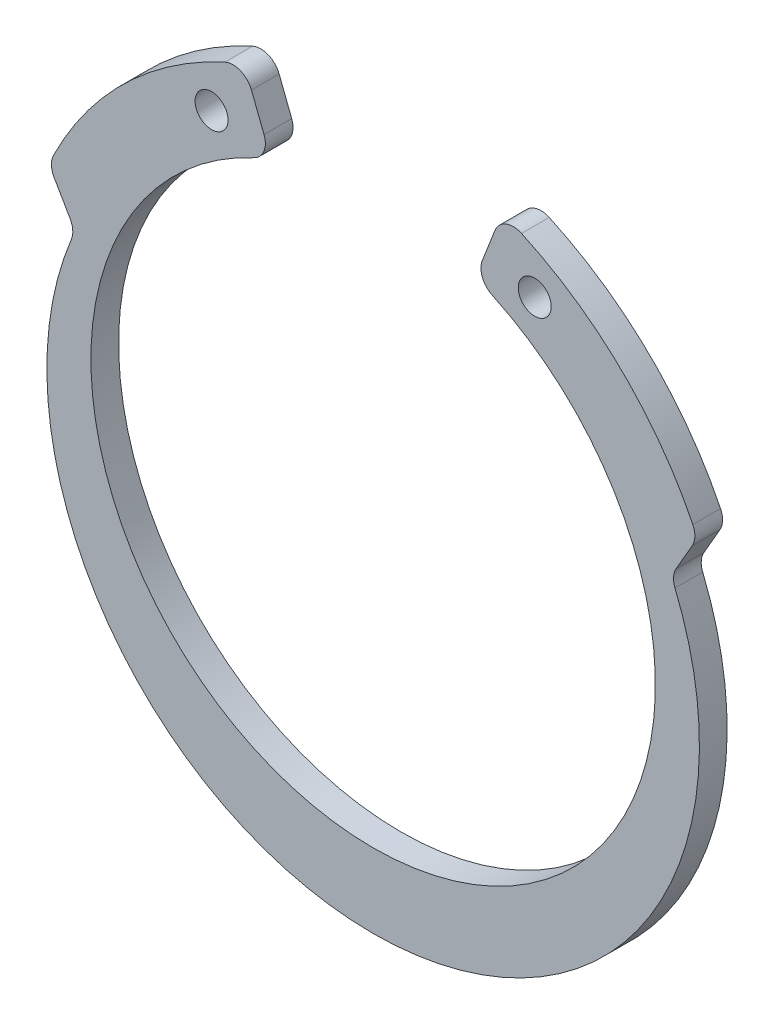
ISO-10303-21;
HEADER;
FILE_DESCRIPTION(('STEP AP214'),'2;1');
FILE_NAME('part.step','',(''),(''),'','','');
FILE_SCHEMA(('AUTOMOTIVE_DESIGN { 1 0 10303 214 1 1 1 1 }'));
ENDSEC;
DATA;
#1=APPLICATION_CONTEXT('core data for automotive mechanical design processes');
#2=APPLICATION_PROTOCOL_DEFINITION('international standard','automotive_design',2000,#1);
#3=PRODUCT_CONTEXT('',#1,'mechanical');
#4=PRODUCT('Part','Part','',(#3));
#5=PRODUCT_RELATED_PRODUCT_CATEGORY('part','',(#4));
#6=PRODUCT_DEFINITION_FORMATION('','',#4);
#7=PRODUCT_DEFINITION_CONTEXT('part definition',#1,'design');
#8=PRODUCT_DEFINITION('design','',#6,#7);
#9=PRODUCT_DEFINITION_SHAPE('','',#8);
#10=(LENGTH_UNIT() NAMED_UNIT(*) SI_UNIT(.MILLI.,.METRE.));
#11=(NAMED_UNIT(*) PLANE_ANGLE_UNIT() SI_UNIT($,.RADIAN.));
#12=(NAMED_UNIT(*) SI_UNIT($,.STERADIAN.) SOLID_ANGLE_UNIT());
#13=UNCERTAINTY_MEASURE_WITH_UNIT(LENGTH_MEASURE(1.E-05),#10,'distance_accuracy_value','');
#14=(GEOMETRIC_REPRESENTATION_CONTEXT(3) GLOBAL_UNCERTAINTY_ASSIGNED_CONTEXT((#13)) GLOBAL_UNIT_ASSIGNED_CONTEXT((#10,
#11,#12)) REPRESENTATION_CONTEXT('',''));
#15=CARTESIAN_POINT('',(0.,0.,0.));
#16=DIRECTION('',(0.,0.,1.));
#17=DIRECTION('',(1.,0.,0.));
#18=AXIS2_PLACEMENT_3D('',#15,#16,#17);
#19=CARTESIAN_POINT('',(0.,0.,0.5334));
#20=DIRECTION('',(0.,0.,1.));
#21=DIRECTION('',(1.,0.,0.));
#22=AXIS2_PLACEMENT_3D('',#19,#20,#21);
#23=PLANE('',#22);
#24=DIRECTION('',(-0.36214953271028,-0.932120011563814,0.));
#25=VECTOR('',#24,1.);
#26=CARTESIAN_POINT('',(4.97184228971963,12.7967960027561,0.5334));
#27=LINE('',#26,#25);
#28=CARTESIAN_POINT('',(4.68776887253002,12.0656325108856,0.5334));
#29=VERTEX_POINT('',#28);
#30=CARTESIAN_POINT('',(4.20391030476,10.820251216563,0.5334));
#31=VERTEX_POINT('',#30);
#32=EDGE_CURVE('E280',#29,#31,#27,.T.);
#33=ORIENTED_EDGE('',*,*,#32,.T.);
#34=CARTESIAN_POINT('',(4.91418575357163,10.5442932726377,0.5334));
#35=DIRECTION('',(0.,0.,1.));
#36=DIRECTION('',(1.,0.,0.));
#37=AXIS2_PLACEMENT_3D('',#34,#35,#36);
#38=CIRCLE('',#37,0.762);
#39=CARTESIAN_POINT('',(4.59229585704947,9.85361904080558,0.5334));
#40=VERTEX_POINT('',#39);
#41=EDGE_CURVE('E329',#31,#40,#38,.T.);
#42=ORIENTED_EDGE('',*,*,#41,.T.);
#43=CARTESIAN_POINT('',(0.,0.,0.5334));
#44=DIRECTION('',(0.,0.,-1.));
#45=DIRECTION('',(1.,0.,0.));
#46=AXIS2_PLACEMENT_3D('',#43,#44,#45);
#47=CIRCLE('',#46,10.8712);
#48=CARTESIAN_POINT('',(-4.59229585704947,9.85361904080558,0.5334));
#49=VERTEX_POINT('',#48);
#50=EDGE_CURVE('E285',#40,#49,#47,.T.);
#51=ORIENTED_EDGE('',*,*,#50,.T.);
#52=CARTESIAN_POINT('',(-4.91418575357163,10.5442932726377,0.5334));
#53=DIRECTION('',(0.,0.,-1.));
#54=DIRECTION('',(-1.,0.,0.));
#55=AXIS2_PLACEMENT_3D('',#52,#53,#54);
#56=CIRCLE('',#55,0.762);
#57=CARTESIAN_POINT('',(-4.20391030476,10.820251216563,0.5334));
#58=VERTEX_POINT('',#57);
#59=EDGE_CURVE('E208',#58,#49,#56,.T.);
#60=ORIENTED_EDGE('',*,*,#59,.F.);
#61=DIRECTION('',(0.36214953271028,-0.932120011563814,0.));
#62=VECTOR('',#61,1.);
#63=CARTESIAN_POINT('',(-4.97184228971963,12.7967960027561,0.5334));
#64=LINE('',#63,#62);
#65=CARTESIAN_POINT('',(-4.68776887253002,12.0656325108856,0.5334));
#66=VERTEX_POINT('',#65);
#67=EDGE_CURVE('E580',#66,#58,#64,.T.);
#68=ORIENTED_EDGE('',*,*,#67,.F.);
#69=CARTESIAN_POINT('',(-5.39804432134165,11.7896745669603,0.5334));
#70=DIRECTION('',(0.,0.,-1.));
#71=DIRECTION('',(-1.,0.,0.));
#72=AXIS2_PLACEMENT_3D('',#69,#70,#71);
#73=CIRCLE('',#72,0.762);
#74=CARTESIAN_POINT('',(-5.71526533924615,12.4825055895045,0.5334));
#75=VERTEX_POINT('',#74);
#76=EDGE_CURVE('E237',#75,#66,#73,.T.);
#77=ORIENTED_EDGE('',*,*,#76,.F.);
#78=CARTESIAN_POINT('',(0.,0.,0.5334));
#79=DIRECTION('',(0.,0.,-1.));
#80=DIRECTION('',(-1.,0.,0.));
#81=AXIS2_PLACEMENT_3D('',#78,#79,#80);
#82=CIRCLE('',#81,13.7287);
#83=CARTESIAN_POINT('',(-12.3136431858686,6.07053499957877,0.5334));
#84=VERTEX_POINT('',#83);
#85=EDGE_CURVE('E577',#84,#75,#82,.T.);
#86=ORIENTED_EDGE('',*,*,#85,.F.);
#87=CARTESIAN_POINT('',(-11.6301847296687,5.73359503660493,0.5334));
#88=DIRECTION('',(0.,0.,-1.));
#89=DIRECTION('',(-1.,0.,0.));
#90=AXIS2_PLACEMENT_3D('',#87,#88,#89);
#91=CIRCLE('',#90,0.762);
#92=CARTESIAN_POINT('',(-12.2900960873525,5.35259503660493,0.5334));
#93=VERTEX_POINT('',#92);
#94=EDGE_CURVE('E233',#93,#84,#91,.T.);
#95=ORIENTED_EDGE('',*,*,#94,.F.);
#96=DIRECTION('',(-0.500000000000001,0.866025403784438,0.));
#97=VECTOR('',#96,1.);
#98=CARTESIAN_POINT('',(-12.4900076107703,5.69885195218307,0.5334));
#99=LINE('',#98,#97);
#100=CARTESIAN_POINT('',(-11.6711121790669,4.28048345838686,0.5334));
#101=VERTEX_POINT('',#100);
#102=EDGE_CURVE('E211',#101,#93,#99,.T.);
#103=ORIENTED_EDGE('',*,*,#102,.F.);
#104=CARTESIAN_POINT('',(-12.3310235367507,3.89948345838686,0.5334));
#105=DIRECTION('',(0.,0.,-1.));
#106=DIRECTION('',(-1.,0.,0.));
#107=AXIS2_PLACEMENT_3D('',#104,#105,#106);
#108=CIRCLE('',#107,0.762);
#109=CARTESIAN_POINT('',(-11.6260871872875,3.61015882548211,0.5334));
#110=VERTEX_POINT('',#109);
#111=EDGE_CURVE('E263',#110,#101,#108,.F.);
#112=ORIENTED_EDGE('',*,*,#111,.F.);
#113=CARTESIAN_POINT('',(0.,-1.16149667241045,0.5334));
#114=DIRECTION('',(0.,0.,1.));
#115=DIRECTION('',(1.,0.,0.));
#116=AXIS2_PLACEMENT_3D('',#113,#114,#115);
#117=CIRCLE('',#116,12.5672033275895);
#118=CARTESIAN_POINT('',(11.6260871872875,3.61015882548211,0.5334));
#119=VERTEX_POINT('',#118);
#120=EDGE_CURVE('E288',#110,#119,#117,.T.);
#121=ORIENTED_EDGE('',*,*,#120,.T.);
#122=CARTESIAN_POINT('',(12.3310235367507,3.89948345838686,0.5334));
#123=DIRECTION('',(0.,0.,1.));
#124=DIRECTION('',(1.,0.,0.));
#125=AXIS2_PLACEMENT_3D('',#122,#123,#124);
#126=CIRCLE('',#125,0.762);
#127=CARTESIAN_POINT('',(11.6711121790669,4.28048345838686,0.5334));
#128=VERTEX_POINT('',#127);
#129=EDGE_CURVE('E11',#119,#128,#126,.F.);
#130=ORIENTED_EDGE('',*,*,#129,.T.);
#131=DIRECTION('',(0.500000000000001,0.866025403784438,0.));
#132=VECTOR('',#131,1.);
#133=CARTESIAN_POINT('',(12.4900076107703,5.69885195218307,0.5334));
#134=LINE('',#133,#132);
#135=CARTESIAN_POINT('',(12.2900960873525,5.35259503660493,0.5334));
#136=VERTEX_POINT('',#135);
#137=EDGE_CURVE('E291',#128,#136,#134,.T.);
#138=ORIENTED_EDGE('',*,*,#137,.T.);
#139=CARTESIAN_POINT('',(11.6301847296687,5.73359503660493,0.5334));
#140=DIRECTION('',(0.,0.,1.));
#141=DIRECTION('',(1.,0.,0.));
#142=AXIS2_PLACEMENT_3D('',#139,#140,#141);
#143=CIRCLE('',#142,0.762);
#144=CARTESIAN_POINT('',(12.3136431858686,6.07053499957877,0.5334));
#145=VERTEX_POINT('',#144);
#146=EDGE_CURVE('E323',#136,#145,#143,.T.);
#147=ORIENTED_EDGE('',*,*,#146,.T.);
#148=CARTESIAN_POINT('',(0.,0.,0.5334));
#149=DIRECTION('',(0.,0.,1.));
#150=DIRECTION('',(1.,0.,0.));
#151=AXIS2_PLACEMENT_3D('',#148,#149,#150);
#152=CIRCLE('',#151,13.7287);
#153=CARTESIAN_POINT('',(5.71526533924615,12.4825055895045,0.5334));
#154=VERTEX_POINT('',#153);
#155=EDGE_CURVE('E276',#145,#154,#152,.T.);
#156=ORIENTED_EDGE('',*,*,#155,.T.);
#157=CARTESIAN_POINT('',(5.39804432134165,11.7896745669603,0.5334));
#158=DIRECTION('',(0.,0.,1.));
#159=DIRECTION('',(1.,0.,0.));
#160=AXIS2_PLACEMENT_3D('',#157,#158,#159);
#161=CIRCLE('',#160,0.762);
#162=EDGE_CURVE('E326',#154,#29,#161,.T.);
#163=ORIENTED_EDGE('',*,*,#162,.T.);
#164=EDGE_LOOP('',(#33,#42,#51,#60,#68,#77,#86,#95,#103,#112,#121,#130,#138,#147,#156,#163));
#165=FACE_BOUND('',#164,.T.);
#166=CARTESIAN_POINT('',(6.223,10.609573082952,0.5334));
#167=DIRECTION('',(0.,0.,1.));
#168=DIRECTION('',(1.,0.,0.));
#169=AXIS2_PLACEMENT_3D('',#166,#167,#168);
#170=CIRCLE('',#169,0.635000000000001);
#171=CARTESIAN_POINT('',(6.858,10.609573082952,0.5334));
#172=VERTEX_POINT('',#171);
#173=EDGE_CURVE('E268',#172,#172,#170,.T.);
#174=ORIENTED_EDGE('',*,*,#173,.F.);
#175=EDGE_LOOP('',(#174));
#176=FACE_BOUND('',#175,.T.);
#177=CARTESIAN_POINT('',(-6.223,10.609573082952,0.5334));
#178=DIRECTION('',(0.,0.,-1.));
#179=DIRECTION('',(-1.,0.,0.));
#180=AXIS2_PLACEMENT_3D('',#177,#178,#179);
#181=CIRCLE('',#180,0.635000000000001);
#182=CARTESIAN_POINT('',(-6.858,10.609573082952,0.5334));
#183=VERTEX_POINT('',#182);
#184=EDGE_CURVE('E599',#183,#183,#181,.T.);
#185=ORIENTED_EDGE('',*,*,#184,.T.);
#186=EDGE_LOOP('',(#185));
#187=FACE_BOUND('',#186,.T.);
#188=ADVANCED_FACE('F41',(#165,#176,#187),#23,.T.);
#189=CARTESIAN_POINT('',(0.,0.,-0.5334));
#190=DIRECTION('',(0.,0.,1.));
#191=DIRECTION('',(1.,0.,0.));
#192=AXIS2_PLACEMENT_3D('',#189,#190,#191);
#193=PLANE('',#192);
#194=CARTESIAN_POINT('',(0.,0.,-0.5334));
#195=DIRECTION('',(0.,0.,-1.));
#196=DIRECTION('',(1.,0.,0.));
#197=AXIS2_PLACEMENT_3D('',#194,#195,#196);
#198=CIRCLE('',#197,10.8712);
#199=CARTESIAN_POINT('',(4.59229585704947,9.85361904080558,-0.5334));
#200=VERTEX_POINT('',#199);
#201=CARTESIAN_POINT('',(-4.59229585704947,9.85361904080558,-0.5334));
#202=VERTEX_POINT('',#201);
#203=EDGE_CURVE('E188',#200,#202,#198,.T.);
#204=ORIENTED_EDGE('',*,*,#203,.F.);
#205=CARTESIAN_POINT('',(4.91418575357163,10.5442932726377,-0.5334));
#206=DIRECTION('',(0.,0.,1.));
#207=DIRECTION('',(1.,0.,0.));
#208=AXIS2_PLACEMENT_3D('',#205,#206,#207);
#209=CIRCLE('',#208,0.762);
#210=CARTESIAN_POINT('',(4.20391030476,10.820251216563,-0.5334));
#211=VERTEX_POINT('',#210);
#212=EDGE_CURVE('E313',#200,#211,#209,.F.);
#213=ORIENTED_EDGE('',*,*,#212,.T.);
#214=DIRECTION('',(-0.36214953271028,-0.932120011563814,0.));
#215=VECTOR('',#214,1.);
#216=CARTESIAN_POINT('',(4.97184228971963,12.7967960027561,-0.5334));
#217=LINE('',#216,#215);
#218=CARTESIAN_POINT('',(4.68776887253002,12.0656325108856,-0.5334));
#219=VERTEX_POINT('',#218);
#220=EDGE_CURVE('E200',#219,#211,#217,.T.);
#221=ORIENTED_EDGE('',*,*,#220,.F.);
#222=CARTESIAN_POINT('',(5.39804432134165,11.7896745669603,-0.5334));
#223=DIRECTION('',(0.,0.,1.));
#224=DIRECTION('',(1.,0.,0.));
#225=AXIS2_PLACEMENT_3D('',#222,#223,#224);
#226=CIRCLE('',#225,0.762);
#227=CARTESIAN_POINT('',(5.71526533924615,12.4825055895045,-0.5334));
#228=VERTEX_POINT('',#227);
#229=EDGE_CURVE('E310',#219,#228,#226,.F.);
#230=ORIENTED_EDGE('',*,*,#229,.T.);
#231=CARTESIAN_POINT('',(0.,0.,-0.5334));
#232=DIRECTION('',(0.,0.,1.));
#233=DIRECTION('',(1.,0.,0.));
#234=AXIS2_PLACEMENT_3D('',#231,#232,#233);
#235=CIRCLE('',#234,13.7287);
#236=CARTESIAN_POINT('',(12.3136431858686,6.07053499957877,-0.5334));
#237=VERTEX_POINT('',#236);
#238=EDGE_CURVE('E272',#237,#228,#235,.T.);
#239=ORIENTED_EDGE('',*,*,#238,.F.);
#240=CARTESIAN_POINT('',(11.6301847296687,5.73359503660493,-0.5334));
#241=DIRECTION('',(0.,0.,1.));
#242=DIRECTION('',(1.,0.,0.));
#243=AXIS2_PLACEMENT_3D('',#240,#241,#242);
#244=CIRCLE('',#243,0.762);
#245=CARTESIAN_POINT('',(12.2900960873525,5.35259503660493,-0.5334));
#246=VERTEX_POINT('',#245);
#247=EDGE_CURVE('E307',#237,#246,#244,.F.);
#248=ORIENTED_EDGE('',*,*,#247,.T.);
#249=DIRECTION('',(0.500000000000001,0.866025403784438,0.));
#250=VECTOR('',#249,1.);
#251=CARTESIAN_POINT('',(12.4900076107703,5.69885195218307,-0.5334));
#252=LINE('',#251,#250);
#253=CARTESIAN_POINT('',(11.6711121790669,4.28048345838686,-0.5334));
#254=VERTEX_POINT('',#253);
#255=EDGE_CURVE('E281',#254,#246,#252,.T.);
#256=ORIENTED_EDGE('',*,*,#255,.F.);
#257=CARTESIAN_POINT('',(12.3310235367507,3.89948345838686,-0.5334));
#258=DIRECTION('',(0.,0.,1.));
#259=DIRECTION('',(1.,0.,0.));
#260=AXIS2_PLACEMENT_3D('',#257,#258,#259);
#261=CIRCLE('',#260,0.762);
#262=CARTESIAN_POINT('',(11.6260871872875,3.61015882548211,-0.5334));
#263=VERTEX_POINT('',#262);
#264=EDGE_CURVE('E50',#254,#263,#261,.T.);
#265=ORIENTED_EDGE('',*,*,#264,.T.);
#266=CARTESIAN_POINT('',(0.,-1.16149667241045,-0.5334));
#267=DIRECTION('',(0.,0.,1.));
#268=DIRECTION('',(1.,0.,0.));
#269=AXIS2_PLACEMENT_3D('',#266,#267,#268);
#270=CIRCLE('',#269,12.5672033275895);
#271=CARTESIAN_POINT('',(-11.6260871872875,3.61015882548211,-0.5334));
#272=VERTEX_POINT('',#271);
#273=EDGE_CURVE('E199',#272,#263,#270,.T.);
#274=ORIENTED_EDGE('',*,*,#273,.F.);
#275=CARTESIAN_POINT('',(-12.3310235367507,3.89948345838686,-0.5334));
#276=DIRECTION('',(0.,0.,-1.));
#277=DIRECTION('',(-1.,0.,0.));
#278=AXIS2_PLACEMENT_3D('',#275,#276,#277);
#279=CIRCLE('',#278,0.762);
#280=CARTESIAN_POINT('',(-11.6711121790669,4.28048345838686,-0.5334));
#281=VERTEX_POINT('',#280);
#282=EDGE_CURVE('E259',#281,#272,#279,.T.);
#283=ORIENTED_EDGE('',*,*,#282,.F.);
#284=DIRECTION('',(-0.500000000000001,0.866025403784438,0.));
#285=VECTOR('',#284,1.);
#286=CARTESIAN_POINT('',(-12.4900076107703,5.69885195218307,-0.5334));
#287=LINE('',#286,#285);
#288=CARTESIAN_POINT('',(-12.2900960873525,5.35259503660493,-0.5334));
#289=VERTEX_POINT('',#288);
#290=EDGE_CURVE('E581',#281,#289,#287,.T.);
#291=ORIENTED_EDGE('',*,*,#290,.T.);
#292=CARTESIAN_POINT('',(-11.6301847296687,5.73359503660493,-0.5334));
#293=DIRECTION('',(0.,0.,-1.));
#294=DIRECTION('',(-1.,0.,0.));
#295=AXIS2_PLACEMENT_3D('',#292,#293,#294);
#296=CIRCLE('',#295,0.762);
#297=CARTESIAN_POINT('',(-12.3136431858686,6.07053499957877,-0.5334));
#298=VERTEX_POINT('',#297);
#299=EDGE_CURVE('E210',#298,#289,#296,.F.);
#300=ORIENTED_EDGE('',*,*,#299,.F.);
#301=CARTESIAN_POINT('',(0.,0.,-0.5334));
#302=DIRECTION('',(0.,0.,-1.));
#303=DIRECTION('',(-1.,0.,0.));
#304=AXIS2_PLACEMENT_3D('',#301,#302,#303);
#305=CIRCLE('',#304,13.7287);
#306=CARTESIAN_POINT('',(-5.71526533924615,12.4825055895045,-0.5334));
#307=VERTEX_POINT('',#306);
#308=EDGE_CURVE('E595',#298,#307,#305,.T.);
#309=ORIENTED_EDGE('',*,*,#308,.T.);
#310=CARTESIAN_POINT('',(-5.39804432134165,11.7896745669603,-0.5334));
#311=DIRECTION('',(0.,0.,-1.));
#312=DIRECTION('',(-1.,0.,0.));
#313=AXIS2_PLACEMENT_3D('',#310,#311,#312);
#314=CIRCLE('',#313,0.762);
#315=CARTESIAN_POINT('',(-4.68776887253002,12.0656325108856,-0.5334));
#316=VERTEX_POINT('',#315);
#317=EDGE_CURVE('E220',#316,#307,#314,.F.);
#318=ORIENTED_EDGE('',*,*,#317,.F.);
#319=DIRECTION('',(0.36214953271028,-0.932120011563814,0.));
#320=VECTOR('',#319,1.);
#321=CARTESIAN_POINT('',(-4.97184228971963,12.7967960027561,-0.5334));
#322=LINE('',#321,#320);
#323=CARTESIAN_POINT('',(-4.20391030476,10.820251216563,-0.5334));
#324=VERTEX_POINT('',#323);
#325=EDGE_CURVE('E217',#316,#324,#322,.T.);
#326=ORIENTED_EDGE('',*,*,#325,.T.);
#327=CARTESIAN_POINT('',(-4.91418575357163,10.5442932726377,-0.5334));
#328=DIRECTION('',(0.,0.,-1.));
#329=DIRECTION('',(-1.,0.,0.));
#330=AXIS2_PLACEMENT_3D('',#327,#328,#329);
#331=CIRCLE('',#330,0.762);
#332=EDGE_CURVE('E205',#202,#324,#331,.F.);
#333=ORIENTED_EDGE('',*,*,#332,.F.);
#334=EDGE_LOOP('',(#204,#213,#221,#230,#239,#248,#256,#265,#274,#283,#291,#300,#309,#318,#326,#333));
#335=FACE_BOUND('',#334,.T.);
#336=CARTESIAN_POINT('',(6.223,10.609573082952,-0.5334));
#337=DIRECTION('',(0.,0.,1.));
#338=DIRECTION('',(1.,0.,0.));
#339=AXIS2_PLACEMENT_3D('',#336,#337,#338);
#340=CIRCLE('',#339,0.635000000000001);
#341=CARTESIAN_POINT('',(6.858,10.609573082952,-0.5334));
#342=VERTEX_POINT('',#341);
#343=EDGE_CURVE('E267',#342,#342,#340,.T.);
#344=ORIENTED_EDGE('',*,*,#343,.T.);
#345=EDGE_LOOP('',(#344));
#346=FACE_BOUND('',#345,.T.);
#347=CARTESIAN_POINT('',(-6.223,10.609573082952,-0.5334));
#348=DIRECTION('',(0.,0.,-1.));
#349=DIRECTION('',(-1.,0.,0.));
#350=AXIS2_PLACEMENT_3D('',#347,#348,#349);
#351=CIRCLE('',#350,0.635000000000001);
#352=CARTESIAN_POINT('',(-6.858,10.609573082952,-0.5334));
#353=VERTEX_POINT('',#352);
#354=EDGE_CURVE('E590',#353,#353,#351,.T.);
#355=ORIENTED_EDGE('',*,*,#354,.F.);
#356=EDGE_LOOP('',(#355));
#357=FACE_BOUND('',#356,.T.);
#358=ADVANCED_FACE('F213',(#335,#346,#357),#193,.F.);
#359=CARTESIAN_POINT('',(0.,0.,0.5334));
#360=DIRECTION('',(0.,0.,-1.));
#361=DIRECTION('',(-1.,0.,0.));
#362=AXIS2_PLACEMENT_3D('',#359,#360,#361);
#363=CYLINDRICAL_SURFACE('',#362,13.7287);
#364=ORIENTED_EDGE('',*,*,#238,.T.);
#365=DIRECTION('',(0.,0.,-1.));
#366=VECTOR('',#365,1.);
#367=CARTESIAN_POINT('',(5.71526533924615,12.4825055895045,0.5334));
#368=LINE('',#367,#366);
#369=EDGE_CURVE('E336',#228,#154,#368,.F.);
#370=ORIENTED_EDGE('',*,*,#369,.T.);
#371=ORIENTED_EDGE('',*,*,#155,.F.);
#372=DIRECTION('',(0.,0.,-1.));
#373=VECTOR('',#372,1.);
#374=CARTESIAN_POINT('',(12.3136431858686,6.07053499957877,0.5334));
#375=LINE('',#374,#373);
#376=EDGE_CURVE('E332',#145,#237,#375,.T.);
#377=ORIENTED_EDGE('',*,*,#376,.T.);
#378=EDGE_LOOP('',(#364,#370,#371,#377));
#379=FACE_BOUND('',#378,.T.);
#380=ADVANCED_FACE('F365',(#379),#363,.T.);
#381=CARTESIAN_POINT('',(4.97184228971963,12.7967960027561,0.5334));
#382=DIRECTION('',(0.932120011563814,-0.362149532710281,0.));
#383=DIRECTION('',(0.362149532710281,0.932120011563815,0.));
#384=AXIS2_PLACEMENT_3D('',#381,#382,#383);
#385=PLANE('',#384);
#386=ORIENTED_EDGE('',*,*,#220,.T.);
#387=DIRECTION('',(0.,0.,-1.));
#388=VECTOR('',#387,1.);
#389=CARTESIAN_POINT('',(4.20391030476,10.820251216563,0.5334));
#390=LINE('',#389,#388);
#391=EDGE_CURVE('E320',#211,#31,#390,.F.);
#392=ORIENTED_EDGE('',*,*,#391,.T.);
#393=ORIENTED_EDGE('',*,*,#32,.F.);
#394=DIRECTION('',(0.,0.,-1.));
#395=VECTOR('',#394,1.);
#396=CARTESIAN_POINT('',(4.68776887253002,12.0656325108856,0.5334));
#397=LINE('',#396,#395);
#398=EDGE_CURVE('E316',#29,#219,#397,.T.);
#399=ORIENTED_EDGE('',*,*,#398,.T.);
#400=EDGE_LOOP('',(#386,#392,#393,#399));
#401=FACE_BOUND('',#400,.T.);
#402=ADVANCED_FACE('F374',(#401),#385,.F.);
#403=CARTESIAN_POINT('',(0.,0.,0.5334));
#404=DIRECTION('',(0.,0.,-1.));
#405=DIRECTION('',(-1.,0.,0.));
#406=AXIS2_PLACEMENT_3D('',#403,#404,#405);
#407=CYLINDRICAL_SURFACE('',#406,10.8712);
#408=ORIENTED_EDGE('',*,*,#50,.F.);
#409=DIRECTION('',(0.,0.,-1.));
#410=VECTOR('',#409,1.);
#411=CARTESIAN_POINT('',(4.59229585704947,9.85361904080558,0.5334));
#412=LINE('',#411,#410);
#413=EDGE_CURVE('E195',#40,#200,#412,.T.);
#414=ORIENTED_EDGE('',*,*,#413,.T.);
#415=ORIENTED_EDGE('',*,*,#203,.T.);
#416=DIRECTION('',(0.,0.,-1.));
#417=VECTOR('',#416,1.);
#418=CARTESIAN_POINT('',(-4.59229585704947,9.85361904080558,0.5334));
#419=LINE('',#418,#417);
#420=EDGE_CURVE('E192',#49,#202,#419,.T.);
#421=ORIENTED_EDGE('',*,*,#420,.F.);
#422=EDGE_LOOP('',(#408,#414,#415,#421));
#423=FACE_BOUND('',#422,.T.);
#424=ADVANCED_FACE('F191',(#423),#407,.F.);
#425=CARTESIAN_POINT('',(0.,-1.16149667241045,0.5334));
#426=DIRECTION('',(0.,0.,-1.));
#427=DIRECTION('',(-1.,0.,0.));
#428=AXIS2_PLACEMENT_3D('',#425,#426,#427);
#429=CYLINDRICAL_SURFACE('',#428,12.5672033275895);
#430=ORIENTED_EDGE('',*,*,#273,.T.);
#431=DIRECTION('',(0.,0.,-1.));
#432=VECTOR('',#431,1.);
#433=CARTESIAN_POINT('',(11.6260871872875,3.61015882548212,0.5334));
#434=LINE('',#433,#432);
#435=EDGE_CURVE('E345',#263,#119,#434,.F.);
#436=ORIENTED_EDGE('',*,*,#435,.T.);
#437=ORIENTED_EDGE('',*,*,#120,.F.);
#438=DIRECTION('',(0.,0.,-1.));
#439=VECTOR('',#438,1.);
#440=CARTESIAN_POINT('',(-11.6260871872875,3.61015882548212,0.5334));
#441=LINE('',#440,#439);
#442=EDGE_CURVE('E255',#272,#110,#441,.F.);
#443=ORIENTED_EDGE('',*,*,#442,.F.);
#444=EDGE_LOOP('',(#430,#436,#437,#443));
#445=FACE_BOUND('',#444,.T.);
#446=ADVANCED_FACE('F355',(#445),#429,.T.);
#447=CARTESIAN_POINT('',(12.4900076107703,5.69885195218307,0.5334));
#448=DIRECTION('',(-0.866025403784438,0.500000000000001,0.));
#449=DIRECTION('',(-0.500000000000001,-0.866025403784438,0.));
#450=AXIS2_PLACEMENT_3D('',#447,#448,#449);
#451=PLANE('',#450);
#452=ORIENTED_EDGE('',*,*,#137,.F.);
#453=DIRECTION('',(0.,0.,1.));
#454=VECTOR('',#453,1.);
#455=CARTESIAN_POINT('',(11.6711121790669,4.28048345838686,-0.5334));
#456=LINE('',#455,#454);
#457=EDGE_CURVE('E341',#128,#254,#456,.F.);
#458=ORIENTED_EDGE('',*,*,#457,.T.);
#459=ORIENTED_EDGE('',*,*,#255,.T.);
#460=DIRECTION('',(0.,0.,-1.));
#461=VECTOR('',#460,1.);
#462=CARTESIAN_POINT('',(12.2900960873525,5.35259503660493,0.5334));
#463=LINE('',#462,#461);
#464=EDGE_CURVE('E60',#246,#136,#463,.F.);
#465=ORIENTED_EDGE('',*,*,#464,.T.);
#466=EDGE_LOOP('',(#452,#458,#459,#465));
#467=FACE_BOUND('',#466,.T.);
#468=ADVANCED_FACE('F357',(#467),#451,.F.);
#469=CARTESIAN_POINT('',(6.223,10.609573082952,0.5334));
#470=DIRECTION('',(0.,0.,-1.));
#471=DIRECTION('',(-1.,0.,0.));
#472=AXIS2_PLACEMENT_3D('',#469,#470,#471);
#473=CYLINDRICAL_SURFACE('',#472,0.635000000000001);
#474=ORIENTED_EDGE('',*,*,#173,.T.);
#475=EDGE_LOOP('',(#474));
#476=FACE_BOUND('',#475,.T.);
#477=ORIENTED_EDGE('',*,*,#343,.F.);
#478=EDGE_LOOP('',(#477));
#479=FACE_BOUND('',#478,.T.);
#480=ADVANCED_FACE('F380',(#476,#479),#473,.F.);
#481=CARTESIAN_POINT('',(4.91418575357163,10.5442932726377,0.5334));
#482=DIRECTION('',(0.,0.,-1.));
#483=DIRECTION('',(-1.,0.,0.));
#484=AXIS2_PLACEMENT_3D('',#481,#482,#483);
#485=CYLINDRICAL_SURFACE('',#484,0.762);
#486=ORIENTED_EDGE('',*,*,#41,.F.);
#487=ORIENTED_EDGE('',*,*,#391,.F.);
#488=ORIENTED_EDGE('',*,*,#212,.F.);
#489=ORIENTED_EDGE('',*,*,#413,.F.);
#490=EDGE_LOOP('',(#486,#487,#488,#489));
#491=FACE_BOUND('',#490,.T.);
#492=ADVANCED_FACE('F378',(#491),#485,.T.);
#493=CARTESIAN_POINT('',(5.39804432134165,11.7896745669603,0.5334));
#494=DIRECTION('',(0.,0.,-1.));
#495=DIRECTION('',(-1.,0.,0.));
#496=AXIS2_PLACEMENT_3D('',#493,#494,#495);
#497=CYLINDRICAL_SURFACE('',#496,0.762);
#498=ORIENTED_EDGE('',*,*,#162,.F.);
#499=ORIENTED_EDGE('',*,*,#369,.F.);
#500=ORIENTED_EDGE('',*,*,#229,.F.);
#501=ORIENTED_EDGE('',*,*,#398,.F.);
#502=EDGE_LOOP('',(#498,#499,#500,#501));
#503=FACE_BOUND('',#502,.T.);
#504=ADVANCED_FACE('F371',(#503),#497,.T.);
#505=CARTESIAN_POINT('',(12.3310235367507,3.89948345838686,0.5334));
#506=DIRECTION('',(0.,0.,-1.));
#507=DIRECTION('',(-1.,0.,0.));
#508=AXIS2_PLACEMENT_3D('',#505,#506,#507);
#509=CYLINDRICAL_SURFACE('',#508,0.762);
#510=ORIENTED_EDGE('',*,*,#129,.F.);
#511=ORIENTED_EDGE('',*,*,#435,.F.);
#512=ORIENTED_EDGE('',*,*,#264,.F.);
#513=ORIENTED_EDGE('',*,*,#457,.F.);
#514=EDGE_LOOP('',(#510,#511,#512,#513));
#515=FACE_BOUND('',#514,.T.);
#516=ADVANCED_FACE('F356',(#515),#509,.F.);
#517=CARTESIAN_POINT('',(11.6301847296687,5.73359503660493,0.5334));
#518=DIRECTION('',(0.,0.,-1.));
#519=DIRECTION('',(-1.,0.,0.));
#520=AXIS2_PLACEMENT_3D('',#517,#518,#519);
#521=CYLINDRICAL_SURFACE('',#520,0.762);
#522=ORIENTED_EDGE('',*,*,#146,.F.);
#523=ORIENTED_EDGE('',*,*,#464,.F.);
#524=ORIENTED_EDGE('',*,*,#247,.F.);
#525=ORIENTED_EDGE('',*,*,#376,.F.);
#526=EDGE_LOOP('',(#522,#523,#524,#525));
#527=FACE_BOUND('',#526,.T.);
#528=ADVANCED_FACE('F43',(#527),#521,.T.);
#529=CARTESIAN_POINT('',(0.,0.,0.5334));
#530=DIRECTION('',(0.,0.,-1.));
#531=DIRECTION('',(1.,0.,0.));
#532=AXIS2_PLACEMENT_3D('',#529,#530,#531);
#533=CYLINDRICAL_SURFACE('',#532,13.7287);
#534=ORIENTED_EDGE('',*,*,#308,.F.);
#535=DIRECTION('',(0.,0.,-1.));
#536=VECTOR('',#535,1.);
#537=CARTESIAN_POINT('',(-12.3136431858686,6.07053499957877,0.5334));
#538=LINE('',#537,#536);
#539=EDGE_CURVE('E243',#84,#298,#538,.T.);
#540=ORIENTED_EDGE('',*,*,#539,.F.);
#541=ORIENTED_EDGE('',*,*,#85,.T.);
#542=DIRECTION('',(0.,0.,-1.));
#543=VECTOR('',#542,1.);
#544=CARTESIAN_POINT('',(-5.71526533924615,12.4825055895045,0.5334));
#545=LINE('',#544,#543);
#546=EDGE_CURVE('E246',#307,#75,#545,.F.);
#547=ORIENTED_EDGE('',*,*,#546,.F.);
#548=EDGE_LOOP('',(#534,#540,#541,#547));
#549=FACE_BOUND('',#548,.T.);
#550=ADVANCED_FACE('F472',(#549),#533,.T.);
#551=CARTESIAN_POINT('',(-4.97184228971963,12.7967960027561,0.5334));
#552=DIRECTION('',(-0.932120011563814,-0.362149532710281,0.));
#553=DIRECTION('',(-0.362149532710281,0.932120011563815,0.));
#554=AXIS2_PLACEMENT_3D('',#551,#552,#553);
#555=PLANE('',#554);
#556=ORIENTED_EDGE('',*,*,#325,.F.);
#557=DIRECTION('',(0.,0.,-1.));
#558=VECTOR('',#557,1.);
#559=CARTESIAN_POINT('',(-4.68776887253002,12.0656325108856,0.5334));
#560=LINE('',#559,#558);
#561=EDGE_CURVE('E219',#66,#316,#560,.T.);
#562=ORIENTED_EDGE('',*,*,#561,.F.);
#563=ORIENTED_EDGE('',*,*,#67,.T.);
#564=DIRECTION('',(0.,0.,-1.));
#565=VECTOR('',#564,1.);
#566=CARTESIAN_POINT('',(-4.20391030476,10.820251216563,0.5334));
#567=LINE('',#566,#565);
#568=EDGE_CURVE('E224',#324,#58,#567,.F.);
#569=ORIENTED_EDGE('',*,*,#568,.F.);
#570=EDGE_LOOP('',(#556,#562,#563,#569));
#571=FACE_BOUND('',#570,.T.);
#572=ADVANCED_FACE('F477',(#571),#555,.F.);
#573=CARTESIAN_POINT('',(-12.4900076107703,5.69885195218307,0.5334));
#574=DIRECTION('',(0.866025403784438,0.500000000000001,0.));
#575=DIRECTION('',(0.500000000000001,-0.866025403784438,0.));
#576=AXIS2_PLACEMENT_3D('',#573,#574,#575);
#577=PLANE('',#576);
#578=ORIENTED_EDGE('',*,*,#102,.T.);
#579=DIRECTION('',(0.,0.,-1.));
#580=VECTOR('',#579,1.);
#581=CARTESIAN_POINT('',(-12.2900960873525,5.35259503660493,0.5334));
#582=LINE('',#581,#580);
#583=EDGE_CURVE('E249',#289,#93,#582,.F.);
#584=ORIENTED_EDGE('',*,*,#583,.F.);
#585=ORIENTED_EDGE('',*,*,#290,.F.);
#586=DIRECTION('',(0.,0.,1.));
#587=VECTOR('',#586,1.);
#588=CARTESIAN_POINT('',(-11.6711121790669,4.28048345838686,-0.5334));
#589=LINE('',#588,#587);
#590=EDGE_CURVE('E252',#101,#281,#589,.F.);
#591=ORIENTED_EDGE('',*,*,#590,.F.);
#592=EDGE_LOOP('',(#578,#584,#585,#591));
#593=FACE_BOUND('',#592,.T.);
#594=ADVANCED_FACE('F486',(#593),#577,.F.);
#595=CARTESIAN_POINT('',(-6.223,10.609573082952,0.5334));
#596=DIRECTION('',(0.,0.,-1.));
#597=DIRECTION('',(1.,0.,0.));
#598=AXIS2_PLACEMENT_3D('',#595,#596,#597);
#599=CYLINDRICAL_SURFACE('',#598,0.635000000000001);
#600=ORIENTED_EDGE('',*,*,#184,.F.);
#601=EDGE_LOOP('',(#600));
#602=FACE_BOUND('',#601,.T.);
#603=ORIENTED_EDGE('',*,*,#354,.T.);
#604=EDGE_LOOP('',(#603));
#605=FACE_BOUND('',#604,.T.);
#606=ADVANCED_FACE('F495',(#602,#605),#599,.F.);
#607=CARTESIAN_POINT('',(-4.91418575357163,10.5442932726377,0.5334));
#608=DIRECTION('',(0.,0.,-1.));
#609=DIRECTION('',(1.,0.,0.));
#610=AXIS2_PLACEMENT_3D('',#607,#608,#609);
#611=CYLINDRICAL_SURFACE('',#610,0.762);
#612=ORIENTED_EDGE('',*,*,#59,.T.);
#613=ORIENTED_EDGE('',*,*,#420,.T.);
#614=ORIENTED_EDGE('',*,*,#332,.T.);
#615=ORIENTED_EDGE('',*,*,#568,.T.);
#616=EDGE_LOOP('',(#612,#613,#614,#615));
#617=FACE_BOUND('',#616,.T.);
#618=ADVANCED_FACE('F204',(#617),#611,.T.);
#619=CARTESIAN_POINT('',(-5.39804432134165,11.7896745669603,0.5334));
#620=DIRECTION('',(0.,0.,-1.));
#621=DIRECTION('',(1.,0.,0.));
#622=AXIS2_PLACEMENT_3D('',#619,#620,#621);
#623=CYLINDRICAL_SURFACE('',#622,0.762);
#624=ORIENTED_EDGE('',*,*,#76,.T.);
#625=ORIENTED_EDGE('',*,*,#561,.T.);
#626=ORIENTED_EDGE('',*,*,#317,.T.);
#627=ORIENTED_EDGE('',*,*,#546,.T.);
#628=EDGE_LOOP('',(#624,#625,#626,#627));
#629=FACE_BOUND('',#628,.T.);
#630=ADVANCED_FACE('F513',(#629),#623,.T.);
#631=CARTESIAN_POINT('',(-12.3310235367507,3.89948345838686,0.5334));
#632=DIRECTION('',(0.,0.,-1.));
#633=DIRECTION('',(1.,0.,0.));
#634=AXIS2_PLACEMENT_3D('',#631,#632,#633);
#635=CYLINDRICAL_SURFACE('',#634,0.762);
#636=ORIENTED_EDGE('',*,*,#111,.T.);
#637=ORIENTED_EDGE('',*,*,#590,.T.);
#638=ORIENTED_EDGE('',*,*,#282,.T.);
#639=ORIENTED_EDGE('',*,*,#442,.T.);
#640=EDGE_LOOP('',(#636,#637,#638,#639));
#641=FACE_BOUND('',#640,.T.);
#642=ADVANCED_FACE('F521',(#641),#635,.F.);
#643=CARTESIAN_POINT('',(-11.6301847296687,5.73359503660493,0.5334));
#644=DIRECTION('',(0.,0.,-1.));
#645=DIRECTION('',(1.,0.,0.));
#646=AXIS2_PLACEMENT_3D('',#643,#644,#645);
#647=CYLINDRICAL_SURFACE('',#646,0.762);
#648=ORIENTED_EDGE('',*,*,#94,.T.);
#649=ORIENTED_EDGE('',*,*,#539,.T.);
#650=ORIENTED_EDGE('',*,*,#299,.T.);
#651=ORIENTED_EDGE('',*,*,#583,.T.);
#652=EDGE_LOOP('',(#648,#649,#650,#651));
#653=FACE_BOUND('',#652,.T.);
#654=ADVANCED_FACE('F530',(#653),#647,.T.);
#655=CLOSED_SHELL('',(#188,#358,#380,#402,#424,#446,#468,#480,#492,#504,#516,#528,#550,#572,
#594,#606,#618,#630,#642,#654));
#656=MANIFOLD_SOLID_BREP('B2',#655);
#657=ADVANCED_BREP_SHAPE_REPRESENTATION('',(#18,#656),#14);
#658=SHAPE_DEFINITION_REPRESENTATION(#9,#657);
ENDSEC;
END-ISO-10303-21;
